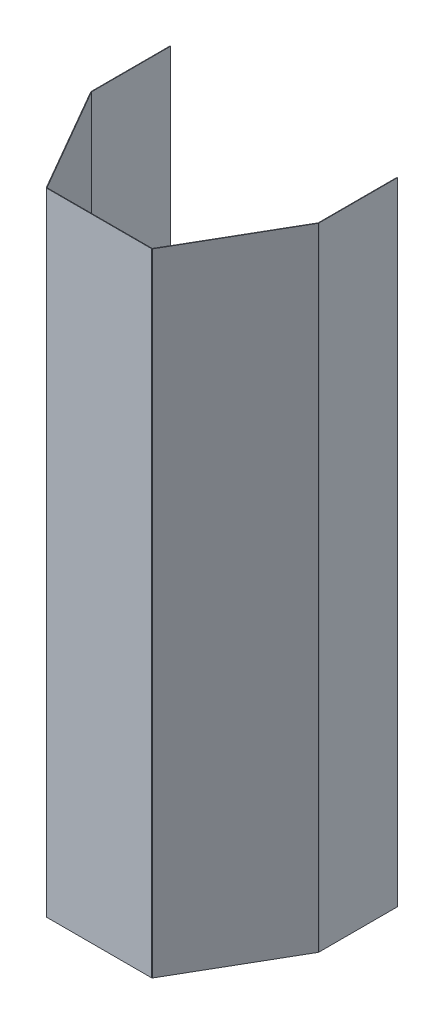
ISO-10303-21;
HEADER;
FILE_DESCRIPTION(('STEP AP214'),'2;1');
FILE_NAME('part.step','',(''),(''),'','','');
FILE_SCHEMA(('AUTOMOTIVE_DESIGN { 1 0 10303 214 1 1 1 1 }'));
ENDSEC;
DATA;
#1=APPLICATION_CONTEXT('core data for automotive mechanical design processes');
#2=APPLICATION_PROTOCOL_DEFINITION('international standard','automotive_design',2000,#1);
#3=PRODUCT_CONTEXT('',#1,'mechanical');
#4=PRODUCT('Part','Part','',(#3));
#5=PRODUCT_RELATED_PRODUCT_CATEGORY('part','',(#4));
#6=PRODUCT_DEFINITION_FORMATION('','',#4);
#7=PRODUCT_DEFINITION_CONTEXT('part definition',#1,'design');
#8=PRODUCT_DEFINITION('design','',#6,#7);
#9=PRODUCT_DEFINITION_SHAPE('','',#8);
#10=(LENGTH_UNIT() NAMED_UNIT(*) SI_UNIT(.MILLI.,.METRE.));
#11=(NAMED_UNIT(*) PLANE_ANGLE_UNIT() SI_UNIT($,.RADIAN.));
#12=(NAMED_UNIT(*) SI_UNIT($,.STERADIAN.) SOLID_ANGLE_UNIT());
#13=UNCERTAINTY_MEASURE_WITH_UNIT(LENGTH_MEASURE(1.E-05),#10,'distance_accuracy_value','');
#14=(GEOMETRIC_REPRESENTATION_CONTEXT(3) GLOBAL_UNCERTAINTY_ASSIGNED_CONTEXT((#13)) GLOBAL_UNIT_ASSIGNED_CONTEXT((#10,
#11,#12)) REPRESENTATION_CONTEXT('',''));
#15=CARTESIAN_POINT('',(0.,0.,0.));
#16=DIRECTION('',(0.,0.,1.));
#17=DIRECTION('',(1.,0.,0.));
#18=AXIS2_PLACEMENT_3D('',#15,#16,#17);
#19=CARTESIAN_POINT('',(-215.371368150354,1200.,-199.829071375145));
#20=DIRECTION('',(0.,1.,0.));
#21=DIRECTION('',(0.,0.,1.));
#22=AXIS2_PLACEMENT_3D('',#19,#20,#21);
#23=PLANE('',#22);
#24=DIRECTION('',(-0.866025403784471,0.,0.499999999999945));
#25=VECTOR('',#24,1.);
#26=CARTESIAN_POINT('',(-215.371368150354,1200.,-199.829071375145));
#27=LINE('',#26,#25);
#28=CARTESIAN_POINT('',(-215.371368150354,1200.,-199.829071375145));
#29=VERTEX_POINT('',#28);
#30=CARTESIAN_POINT('',(-216.237393554139,1200.,-199.329071375145));
#31=VERTEX_POINT('',#30);
#32=EDGE_CURVE('E11',#29,#31,#27,.T.);
#33=ORIENTED_EDGE('',*,*,#32,.F.);
#34=CARTESIAN_POINT('',(-214.733453837927,1200.,-200.197371375145));
#35=DIRECTION('',(0.,-1.,0.));
#36=DIRECTION('',(0.,0.,-1.));
#37=AXIS2_PLACEMENT_3D('',#34,#35,#36);
#38=CIRCLE('',#37,0.7366);
#39=CARTESIAN_POINT('',(-215.470053837926,1200.,-200.197371375145));
#40=VERTEX_POINT('',#39);
#41=EDGE_CURVE('E368',#40,#29,#38,.F.);
#42=ORIENTED_EDGE('',*,*,#41,.F.);
#43=DIRECTION('',(1.,0.,0.));
#44=VECTOR('',#43,1.);
#45=CARTESIAN_POINT('',(-216.470053837927,1200.,-200.197371375145));
#46=LINE('',#45,#44);
#47=CARTESIAN_POINT('',(-216.470053837927,1200.,-200.197371375145));
#48=VERTEX_POINT('',#47);
#49=EDGE_CURVE('E47',#48,#40,#46,.T.);
#50=ORIENTED_EDGE('',*,*,#49,.F.);
#51=CARTESIAN_POINT('',(-214.733453837927,1200.,-200.197371375145));
#52=DIRECTION('',(0.,1.,0.));
#53=DIRECTION('',(1.,0.,0.));
#54=AXIS2_PLACEMENT_3D('',#51,#52,#53);
#55=CIRCLE('',#54,1.7366);
#56=EDGE_CURVE('E381',#48,#31,#55,.T.);
#57=ORIENTED_EDGE('',*,*,#56,.T.);
#58=EDGE_LOOP('',(#33,#42,#50,#57));
#59=FACE_BOUND('',#58,.T.);
#60=ADVANCED_FACE('F39',(#59),#23,.T.);
#61=CARTESIAN_POINT('',(-216.470053837927,1200.,-200.197371375145));
#62=DIRECTION('',(0.,1.,0.));
#63=DIRECTION('',(0.,0.,1.));
#64=AXIS2_PLACEMENT_3D('',#61,#62,#63);
#65=PLANE('',#64);
#66=DIRECTION('',(0.500000000000004,0.,0.866025403784436));
#67=VECTOR('',#66,1.);
#68=CARTESIAN_POINT('',(-100.,1200.,0.));
#69=LINE('',#68,#67);
#70=CARTESIAN_POINT('',(-100.212638104143,1200.,-0.3683));
#71=VERTEX_POINT('',#70);
#72=EDGE_CURVE('E372',#29,#71,#69,.T.);
#73=ORIENTED_EDGE('',*,*,#72,.F.);
#74=ORIENTED_EDGE('',*,*,#32,.T.);
#75=DIRECTION('',(0.500000000000004,0.,0.866025403784436));
#76=VECTOR('',#75,1.);
#77=CARTESIAN_POINT('',(-100.866025403784,1200.,0.500000000000004));
#78=LINE('',#77,#76);
#79=CARTESIAN_POINT('',(-101.078663507927,1200.,0.131700000000003));
#80=VERTEX_POINT('',#79);
#81=EDGE_CURVE('E383',#31,#80,#78,.T.);
#82=ORIENTED_EDGE('',*,*,#81,.T.);
#83=DIRECTION('',(0.866025403784438,0.,-0.5));
#84=VECTOR('',#83,1.);
#85=CARTESIAN_POINT('',(-101.078663507927,1200.,0.131700000000003));
#86=LINE('',#85,#84);
#87=EDGE_CURVE('E342',#80,#71,#86,.T.);
#88=ORIENTED_EDGE('',*,*,#87,.T.);
#89=EDGE_LOOP('',(#73,#74,#82,#88));
#90=FACE_BOUND('',#89,.T.);
#91=ADVANCED_FACE('F452',(#90),#65,.T.);
#92=CARTESIAN_POINT('',(-215.470053837926,0.,-200.197371375145));
#93=DIRECTION('',(0.,-1.,0.));
#94=DIRECTION('',(0.,0.,-1.));
#95=AXIS2_PLACEMENT_3D('',#92,#93,#94);
#96=PLANE('',#95);
#97=DIRECTION('',(-1.,0.,0.));
#98=VECTOR('',#97,1.);
#99=CARTESIAN_POINT('',(-215.470053837926,0.,-200.197371375145));
#100=LINE('',#99,#98);
#101=CARTESIAN_POINT('',(-215.470053837926,0.,-200.197371375145));
#102=VERTEX_POINT('',#101);
#103=CARTESIAN_POINT('',(-216.470053837927,0.,-200.197371375145));
#104=VERTEX_POINT('',#103);
#105=EDGE_CURVE('E348',#102,#104,#100,.T.);
#106=ORIENTED_EDGE('',*,*,#105,.F.);
#107=CARTESIAN_POINT('',(-214.733453837927,0.,-200.197371375145));
#108=DIRECTION('',(0.,-1.,0.));
#109=DIRECTION('',(0.,0.,-1.));
#110=AXIS2_PLACEMENT_3D('',#107,#108,#109);
#111=CIRCLE('',#110,0.7366);
#112=CARTESIAN_POINT('',(-215.371368150354,0.,-199.829071375145));
#113=VERTEX_POINT('',#112);
#114=EDGE_CURVE('E252',#102,#113,#111,.F.);
#115=ORIENTED_EDGE('',*,*,#114,.T.);
#116=DIRECTION('',(0.866025403784471,0.,-0.499999999999945));
#117=VECTOR('',#116,1.);
#118=CARTESIAN_POINT('',(-216.237393554139,0.,-199.329071375145));
#119=LINE('',#118,#117);
#120=CARTESIAN_POINT('',(-216.237393554139,0.,-199.329071375145));
#121=VERTEX_POINT('',#120);
#122=EDGE_CURVE('E346',#121,#113,#119,.T.);
#123=ORIENTED_EDGE('',*,*,#122,.F.);
#124=CARTESIAN_POINT('',(-214.733453837927,0.,-200.197371375145));
#125=DIRECTION('',(0.,1.,0.));
#126=DIRECTION('',(1.,0.,0.));
#127=AXIS2_PLACEMENT_3D('',#124,#125,#126);
#128=CIRCLE('',#127,1.7366);
#129=EDGE_CURVE('E264',#104,#121,#128,.T.);
#130=ORIENTED_EDGE('',*,*,#129,.F.);
#131=EDGE_LOOP('',(#106,#115,#123,#130));
#132=FACE_BOUND('',#131,.T.);
#133=ADVANCED_FACE('F494',(#132),#96,.T.);
#134=CARTESIAN_POINT('',(-216.237393554139,0.,-199.329071375145));
#135=DIRECTION('',(0.,-1.,0.));
#136=DIRECTION('',(0.,0.,-1.));
#137=AXIS2_PLACEMENT_3D('',#134,#135,#136);
#138=PLANE('',#137);
#139=DIRECTION('',(0.,0.,1.));
#140=VECTOR('',#139,1.);
#141=CARTESIAN_POINT('',(-215.470053837926,0.,-200.));
#142=LINE('',#141,#140);
#143=CARTESIAN_POINT('',(-215.470053837926,0.,-350.));
#144=VERTEX_POINT('',#143);
#145=EDGE_CURVE('E255',#144,#102,#142,.T.);
#146=ORIENTED_EDGE('',*,*,#145,.T.);
#147=ORIENTED_EDGE('',*,*,#105,.T.);
#148=DIRECTION('',(0.,0.,1.));
#149=VECTOR('',#148,1.);
#150=CARTESIAN_POINT('',(-216.470053837926,0.,-200.));
#151=LINE('',#150,#149);
#152=CARTESIAN_POINT('',(-216.470053837926,0.,-350.));
#153=VERTEX_POINT('',#152);
#154=EDGE_CURVE('E261',#153,#104,#151,.T.);
#155=ORIENTED_EDGE('',*,*,#154,.F.);
#156=DIRECTION('',(1.,0.,0.));
#157=VECTOR('',#156,1.);
#158=CARTESIAN_POINT('',(-216.470053837926,0.,-350.));
#159=LINE('',#158,#157);
#160=EDGE_CURVE('E258',#153,#144,#159,.T.);
#161=ORIENTED_EDGE('',*,*,#160,.T.);
#162=EDGE_LOOP('',(#146,#147,#155,#161));
#163=FACE_BOUND('',#162,.T.);
#164=ADVANCED_FACE('F498',(#163),#138,.T.);
#165=CARTESIAN_POINT('',(-99.5747237917149,1200.,0.));
#166=DIRECTION('',(0.,1.,0.));
#167=DIRECTION('',(0.,0.,1.));
#168=AXIS2_PLACEMENT_3D('',#165,#166,#167);
#169=PLANE('',#168);
#170=DIRECTION('',(0.,0.,1.));
#171=VECTOR('',#170,1.);
#172=CARTESIAN_POINT('',(-99.5747237917149,1200.,0.));
#173=LINE('',#172,#171);
#174=CARTESIAN_POINT('',(-99.5747237917149,1200.,0.));
#175=VERTEX_POINT('',#174);
#176=CARTESIAN_POINT('',(-99.5747237917149,1200.,1.));
#177=VERTEX_POINT('',#176);
#178=EDGE_CURVE('E344',#175,#177,#173,.T.);
#179=ORIENTED_EDGE('',*,*,#178,.F.);
#180=CARTESIAN_POINT('',(-99.5747237917149,1200.,-0.736600000000001));
#181=DIRECTION('',(0.,-1.,0.));
#182=DIRECTION('',(0.,0.,-1.));
#183=AXIS2_PLACEMENT_3D('',#180,#181,#182);
#184=CIRCLE('',#183,0.7366);
#185=EDGE_CURVE('E442',#71,#175,#184,.F.);
#186=ORIENTED_EDGE('',*,*,#185,.F.);
#187=ORIENTED_EDGE('',*,*,#87,.F.);
#188=CARTESIAN_POINT('',(-99.5747237917149,1200.,-0.736600000000001));
#189=DIRECTION('',(0.,1.,0.));
#190=DIRECTION('',(1.,0.,0.));
#191=AXIS2_PLACEMENT_3D('',#188,#189,#190);
#192=CIRCLE('',#191,1.7366);
#193=EDGE_CURVE('E386',#80,#177,#192,.T.);
#194=ORIENTED_EDGE('',*,*,#193,.T.);
#195=EDGE_LOOP('',(#179,#186,#187,#194));
#196=FACE_BOUND('',#195,.T.);
#197=ADVANCED_FACE('F459',(#196),#169,.T.);
#198=CARTESIAN_POINT('',(-101.078663507927,1200.,0.131700000000003));
#199=DIRECTION('',(0.,1.,0.));
#200=DIRECTION('',(0.,0.,1.));
#201=AXIS2_PLACEMENT_3D('',#198,#199,#200);
#202=PLANE('',#201);
#203=DIRECTION('',(1.,0.,0.));
#204=VECTOR('',#203,1.);
#205=CARTESIAN_POINT('',(-100.,1200.,0.));
#206=LINE('',#205,#204);
#207=CARTESIAN_POINT('',(99.5747237917149,1200.,0.));
#208=VERTEX_POINT('',#207);
#209=EDGE_CURVE('E439',#175,#208,#206,.T.);
#210=ORIENTED_EDGE('',*,*,#209,.F.);
#211=ORIENTED_EDGE('',*,*,#178,.T.);
#212=DIRECTION('',(1.,0.,0.));
#213=VECTOR('',#212,1.);
#214=CARTESIAN_POINT('',(-100.,1200.,1.));
#215=LINE('',#214,#213);
#216=CARTESIAN_POINT('',(99.5747237917149,1200.,0.999999999999969));
#217=VERTEX_POINT('',#216);
#218=EDGE_CURVE('E206',#177,#217,#215,.T.);
#219=ORIENTED_EDGE('',*,*,#218,.T.);
#220=DIRECTION('',(0.,0.,-1.));
#221=VECTOR('',#220,1.);
#222=CARTESIAN_POINT('',(99.5747237917149,1200.,0.999999999999969));
#223=LINE('',#222,#221);
#224=EDGE_CURVE('E197',#217,#208,#223,.T.);
#225=ORIENTED_EDGE('',*,*,#224,.T.);
#226=EDGE_LOOP('',(#210,#211,#219,#225));
#227=FACE_BOUND('',#226,.T.);
#228=ADVANCED_FACE('F392',(#227),#202,.T.);
#229=CARTESIAN_POINT('',(-100.212638104143,0.,-0.3683));
#230=DIRECTION('',(0.,-1.,0.));
#231=DIRECTION('',(0.,0.,-1.));
#232=AXIS2_PLACEMENT_3D('',#229,#230,#231);
#233=PLANE('',#232);
#234=DIRECTION('',(-0.866025403784438,0.,0.5));
#235=VECTOR('',#234,1.);
#236=CARTESIAN_POINT('',(-100.212638104143,0.,-0.3683));
#237=LINE('',#236,#235);
#238=CARTESIAN_POINT('',(-100.212638104143,0.,-0.3683));
#239=VERTEX_POINT('',#238);
#240=CARTESIAN_POINT('',(-101.078663507927,0.,0.131700000000003));
#241=VERTEX_POINT('',#240);
#242=EDGE_CURVE('E340',#239,#241,#237,.T.);
#243=ORIENTED_EDGE('',*,*,#242,.F.);
#244=CARTESIAN_POINT('',(-99.5747237917149,0.,-0.736600000000001));
#245=DIRECTION('',(0.,-1.,0.));
#246=DIRECTION('',(0.,0.,-1.));
#247=AXIS2_PLACEMENT_3D('',#244,#245,#246);
#248=CIRCLE('',#247,0.7366);
#249=CARTESIAN_POINT('',(-99.5747237917149,0.,0.));
#250=VERTEX_POINT('',#249);
#251=EDGE_CURVE('E246',#239,#250,#248,.F.);
#252=ORIENTED_EDGE('',*,*,#251,.T.);
#253=DIRECTION('',(0.,0.,-1.));
#254=VECTOR('',#253,1.);
#255=CARTESIAN_POINT('',(-99.5747237917149,0.,1.));
#256=LINE('',#255,#254);
#257=CARTESIAN_POINT('',(-99.5747237917149,0.,1.));
#258=VERTEX_POINT('',#257);
#259=EDGE_CURVE('E196',#258,#250,#256,.T.);
#260=ORIENTED_EDGE('',*,*,#259,.F.);
#261=CARTESIAN_POINT('',(-99.5747237917149,0.,-0.736600000000001));
#262=DIRECTION('',(0.,1.,0.));
#263=DIRECTION('',(1.,0.,0.));
#264=AXIS2_PLACEMENT_3D('',#261,#262,#263);
#265=CIRCLE('',#264,1.7366);
#266=EDGE_CURVE('E270',#241,#258,#265,.T.);
#267=ORIENTED_EDGE('',*,*,#266,.F.);
#268=EDGE_LOOP('',(#243,#252,#260,#267));
#269=FACE_BOUND('',#268,.T.);
#270=ADVANCED_FACE('F468',(#269),#233,.T.);
#271=CARTESIAN_POINT('',(-99.5747237917149,0.,1.));
#272=DIRECTION('',(0.,-1.,0.));
#273=DIRECTION('',(0.,0.,-1.));
#274=AXIS2_PLACEMENT_3D('',#271,#272,#273);
#275=PLANE('',#274);
#276=DIRECTION('',(0.500000000000004,0.,0.866025403784436));
#277=VECTOR('',#276,1.);
#278=CARTESIAN_POINT('',(-100.,0.,0.));
#279=LINE('',#278,#277);
#280=EDGE_CURVE('E249',#113,#239,#279,.T.);
#281=ORIENTED_EDGE('',*,*,#280,.T.);
#282=ORIENTED_EDGE('',*,*,#242,.T.);
#283=DIRECTION('',(0.500000000000004,0.,0.866025403784436));
#284=VECTOR('',#283,1.);
#285=CARTESIAN_POINT('',(-100.866025403784,0.,0.500000000000004));
#286=LINE('',#285,#284);
#287=EDGE_CURVE('E267',#121,#241,#286,.T.);
#288=ORIENTED_EDGE('',*,*,#287,.F.);
#289=ORIENTED_EDGE('',*,*,#122,.T.);
#290=EDGE_LOOP('',(#281,#282,#288,#289));
#291=FACE_BOUND('',#290,.T.);
#292=ADVANCED_FACE('F472',(#291),#275,.T.);
#293=CARTESIAN_POINT('',(100.212638104143,1200.,-0.368300000000029));
#294=DIRECTION('',(0.,1.,0.));
#295=DIRECTION('',(0.,0.,1.));
#296=AXIS2_PLACEMENT_3D('',#293,#294,#295);
#297=PLANE('',#296);
#298=DIRECTION('',(0.86602540378444,0.,0.499999999999998));
#299=VECTOR('',#298,1.);
#300=CARTESIAN_POINT('',(100.212638104143,1200.,-0.368300000000029));
#301=LINE('',#300,#299);
#302=CARTESIAN_POINT('',(100.212638104143,1200.,-0.368300000000029));
#303=VERTEX_POINT('',#302);
#304=CARTESIAN_POINT('',(101.078663507927,1200.,0.131699999999971));
#305=VERTEX_POINT('',#304);
#306=EDGE_CURVE('E184',#303,#305,#301,.T.);
#307=ORIENTED_EDGE('',*,*,#306,.F.);
#308=CARTESIAN_POINT('',(99.5747237917149,1200.,-0.736600000000031));
#309=DIRECTION('',(0.,-1.,0.));
#310=DIRECTION('',(0.,0.,-1.));
#311=AXIS2_PLACEMENT_3D('',#308,#309,#310);
#312=CIRCLE('',#311,0.7366);
#313=EDGE_CURVE('E404',#208,#303,#312,.F.);
#314=ORIENTED_EDGE('',*,*,#313,.F.);
#315=ORIENTED_EDGE('',*,*,#224,.F.);
#316=CARTESIAN_POINT('',(99.5747237917149,1200.,-0.736600000000031));
#317=DIRECTION('',(0.,1.,0.));
#318=DIRECTION('',(1.,0.,0.));
#319=AXIS2_PLACEMENT_3D('',#316,#317,#318);
#320=CIRCLE('',#319,1.7366);
#321=EDGE_CURVE('E200',#217,#305,#320,.T.);
#322=ORIENTED_EDGE('',*,*,#321,.T.);
#323=EDGE_LOOP('',(#307,#314,#315,#322));
#324=FACE_BOUND('',#323,.T.);
#325=ADVANCED_FACE('F202',(#324),#297,.T.);
#326=CARTESIAN_POINT('',(99.5747237917149,1200.,0.999999999999969));
#327=DIRECTION('',(0.,1.,0.));
#328=DIRECTION('',(0.,0.,1.));
#329=AXIS2_PLACEMENT_3D('',#326,#327,#328);
#330=PLANE('',#329);
#331=DIRECTION('',(0.499999999999998,0.,-0.86602540378444));
#332=VECTOR('',#331,1.);
#333=CARTESIAN_POINT('',(100.,1200.,0.));
#334=LINE('',#333,#332);
#335=CARTESIAN_POINT('',(215.371368150352,1200.,-199.829071375145));
#336=VERTEX_POINT('',#335);
#337=EDGE_CURVE('E191',#303,#336,#334,.T.);
#338=ORIENTED_EDGE('',*,*,#337,.F.);
#339=ORIENTED_EDGE('',*,*,#306,.T.);
#340=DIRECTION('',(0.499999999999998,0.,-0.86602540378444));
#341=VECTOR('',#340,1.);
#342=CARTESIAN_POINT('',(100.866025403784,1200.,0.499999999999961));
#343=LINE('',#342,#341);
#344=CARTESIAN_POINT('',(216.237393554136,1200.,-199.329071375145));
#345=VERTEX_POINT('',#344);
#346=EDGE_CURVE('E188',#305,#345,#343,.T.);
#347=ORIENTED_EDGE('',*,*,#346,.T.);
#348=DIRECTION('',(-0.866025403784404,0.,-0.500000000000061));
#349=VECTOR('',#348,1.);
#350=CARTESIAN_POINT('',(216.237393554136,1200.,-199.329071375145));
#351=LINE('',#350,#349);
#352=EDGE_CURVE('E331',#345,#336,#351,.T.);
#353=ORIENTED_EDGE('',*,*,#352,.T.);
#354=EDGE_LOOP('',(#338,#339,#347,#353));
#355=FACE_BOUND('',#354,.T.);
#356=ADVANCED_FACE('F186',(#355),#330,.T.);
#357=CARTESIAN_POINT('',(99.5747237917149,0.,0.));
#358=DIRECTION('',(0.,-1.,0.));
#359=DIRECTION('',(0.,0.,-1.));
#360=AXIS2_PLACEMENT_3D('',#357,#358,#359);
#361=PLANE('',#360);
#362=DIRECTION('',(0.,0.,1.));
#363=VECTOR('',#362,1.);
#364=CARTESIAN_POINT('',(99.5747237917149,0.,0.));
#365=LINE('',#364,#363);
#366=CARTESIAN_POINT('',(99.5747237917149,0.,0.));
#367=VERTEX_POINT('',#366);
#368=CARTESIAN_POINT('',(99.5747237917149,0.,0.999999999999969));
#369=VERTEX_POINT('',#368);
#370=EDGE_CURVE('E336',#367,#369,#365,.T.);
#371=ORIENTED_EDGE('',*,*,#370,.F.);
#372=CARTESIAN_POINT('',(99.5747237917149,0.,-0.736600000000031));
#373=DIRECTION('',(0.,-1.,0.));
#374=DIRECTION('',(0.,0.,-1.));
#375=AXIS2_PLACEMENT_3D('',#372,#373,#374);
#376=CIRCLE('',#375,0.7366);
#377=CARTESIAN_POINT('',(100.212638104143,0.,-0.368300000000029));
#378=VERTEX_POINT('',#377);
#379=EDGE_CURVE('E240',#367,#378,#376,.F.);
#380=ORIENTED_EDGE('',*,*,#379,.T.);
#381=DIRECTION('',(-0.86602540378444,0.,-0.499999999999998));
#382=VECTOR('',#381,1.);
#383=CARTESIAN_POINT('',(101.078663507927,0.,0.131699999999971));
#384=LINE('',#383,#382);
#385=CARTESIAN_POINT('',(101.078663507927,0.,0.131699999999971));
#386=VERTEX_POINT('',#385);
#387=EDGE_CURVE('E334',#386,#378,#384,.T.);
#388=ORIENTED_EDGE('',*,*,#387,.F.);
#389=CARTESIAN_POINT('',(99.5747237917149,0.,-0.736600000000031));
#390=DIRECTION('',(0.,1.,0.));
#391=DIRECTION('',(1.,0.,0.));
#392=AXIS2_PLACEMENT_3D('',#389,#390,#391);
#393=CIRCLE('',#392,1.7366);
#394=EDGE_CURVE('E213',#369,#386,#393,.T.);
#395=ORIENTED_EDGE('',*,*,#394,.F.);
#396=EDGE_LOOP('',(#371,#380,#388,#395));
#397=FACE_BOUND('',#396,.T.);
#398=ADVANCED_FACE('F398',(#397),#361,.T.);
#399=CARTESIAN_POINT('',(101.078663507927,0.,0.131699999999971));
#400=DIRECTION('',(0.,-1.,0.));
#401=DIRECTION('',(0.,0.,-1.));
#402=AXIS2_PLACEMENT_3D('',#399,#400,#401);
#403=PLANE('',#402);
#404=DIRECTION('',(1.,0.,0.));
#405=VECTOR('',#404,1.);
#406=CARTESIAN_POINT('',(-100.,0.,0.));
#407=LINE('',#406,#405);
#408=EDGE_CURVE('E243',#250,#367,#407,.T.);
#409=ORIENTED_EDGE('',*,*,#408,.T.);
#410=ORIENTED_EDGE('',*,*,#370,.T.);
#411=DIRECTION('',(1.,0.,0.));
#412=VECTOR('',#411,1.);
#413=CARTESIAN_POINT('',(-100.,0.,1.));
#414=LINE('',#413,#412);
#415=EDGE_CURVE('E273',#258,#369,#414,.T.);
#416=ORIENTED_EDGE('',*,*,#415,.F.);
#417=ORIENTED_EDGE('',*,*,#259,.T.);
#418=EDGE_LOOP('',(#409,#410,#416,#417));
#419=FACE_BOUND('',#418,.T.);
#420=ADVANCED_FACE('F478',(#419),#403,.T.);
#421=CARTESIAN_POINT('',(215.470053837924,1200.,-200.197371375145));
#422=DIRECTION('',(0.,1.,0.));
#423=DIRECTION('',(0.,0.,1.));
#424=AXIS2_PLACEMENT_3D('',#421,#422,#423);
#425=PLANE('',#424);
#426=DIRECTION('',(1.,0.,0.));
#427=VECTOR('',#426,1.);
#428=CARTESIAN_POINT('',(215.470053837924,1200.,-200.197371375145));
#429=LINE('',#428,#427);
#430=CARTESIAN_POINT('',(215.470053837924,1200.,-200.197371375145));
#431=VERTEX_POINT('',#430);
#432=CARTESIAN_POINT('',(216.470053837924,1200.,-200.197371375145));
#433=VERTEX_POINT('',#432);
#434=EDGE_CURVE('E55',#431,#433,#429,.T.);
#435=ORIENTED_EDGE('',*,*,#434,.F.);
#436=CARTESIAN_POINT('',(214.733453837924,1200.,-200.197371375145));
#437=DIRECTION('',(0.,-1.,0.));
#438=DIRECTION('',(0.,0.,-1.));
#439=AXIS2_PLACEMENT_3D('',#436,#437,#438);
#440=CIRCLE('',#439,0.7366);
#441=EDGE_CURVE('E432',#336,#431,#440,.F.);
#442=ORIENTED_EDGE('',*,*,#441,.F.);
#443=ORIENTED_EDGE('',*,*,#352,.F.);
#444=CARTESIAN_POINT('',(214.733453837924,1200.,-200.197371375145));
#445=DIRECTION('',(0.,1.,0.));
#446=DIRECTION('',(1.,0.,0.));
#447=AXIS2_PLACEMENT_3D('',#444,#445,#446);
#448=CIRCLE('',#447,1.7366);
#449=EDGE_CURVE('E221',#345,#433,#448,.T.);
#450=ORIENTED_EDGE('',*,*,#449,.T.);
#451=EDGE_LOOP('',(#435,#442,#443,#450));
#452=FACE_BOUND('',#451,.T.);
#453=ADVANCED_FACE('F480',(#452),#425,.T.);
#454=CARTESIAN_POINT('',(216.237393554136,1200.,-199.329071375145));
#455=DIRECTION('',(0.,1.,0.));
#456=DIRECTION('',(0.,0.,1.));
#457=AXIS2_PLACEMENT_3D('',#454,#455,#456);
#458=PLANE('',#457);
#459=DIRECTION('',(0.,0.,-1.));
#460=VECTOR('',#459,1.);
#461=CARTESIAN_POINT('',(215.470053837924,1200.,-200.));
#462=LINE('',#461,#460);
#463=CARTESIAN_POINT('',(215.470053837924,1200.,-350.));
#464=VERTEX_POINT('',#463);
#465=EDGE_CURVE('E430',#431,#464,#462,.T.);
#466=ORIENTED_EDGE('',*,*,#465,.F.);
#467=ORIENTED_EDGE('',*,*,#434,.T.);
#468=DIRECTION('',(0.,0.,-1.));
#469=VECTOR('',#468,1.);
#470=CARTESIAN_POINT('',(216.470053837924,1200.,-200.));
#471=LINE('',#470,#469);
#472=CARTESIAN_POINT('',(216.470053837924,1200.,-350.));
#473=VERTEX_POINT('',#472);
#474=EDGE_CURVE('E133',#433,#473,#471,.T.);
#475=ORIENTED_EDGE('',*,*,#474,.T.);
#476=DIRECTION('',(1.,0.,0.));
#477=VECTOR('',#476,1.);
#478=CARTESIAN_POINT('',(215.470053837924,1200.,-350.));
#479=LINE('',#478,#477);
#480=EDGE_CURVE('E428',#464,#473,#479,.T.);
#481=ORIENTED_EDGE('',*,*,#480,.F.);
#482=EDGE_LOOP('',(#466,#467,#475,#481));
#483=FACE_BOUND('',#482,.T.);
#484=ADVANCED_FACE('F486',(#483),#458,.T.);
#485=CARTESIAN_POINT('',(215.371368150352,0.,-199.829071375145));
#486=DIRECTION('',(0.,-1.,0.));
#487=DIRECTION('',(0.,0.,-1.));
#488=AXIS2_PLACEMENT_3D('',#485,#486,#487);
#489=PLANE('',#488);
#490=DIRECTION('',(0.866025403784404,0.,0.500000000000061));
#491=VECTOR('',#490,1.);
#492=CARTESIAN_POINT('',(215.371368150352,0.,-199.829071375145));
#493=LINE('',#492,#491);
#494=CARTESIAN_POINT('',(215.371368150352,0.,-199.829071375145));
#495=VERTEX_POINT('',#494);
#496=CARTESIAN_POINT('',(216.237393554136,0.,-199.329071375145));
#497=VERTEX_POINT('',#496);
#498=EDGE_CURVE('E120',#495,#497,#493,.T.);
#499=ORIENTED_EDGE('',*,*,#498,.F.);
#500=CARTESIAN_POINT('',(214.733453837924,0.,-200.197371375145));
#501=DIRECTION('',(0.,-1.,0.));
#502=DIRECTION('',(0.,0.,-1.));
#503=AXIS2_PLACEMENT_3D('',#500,#501,#502);
#504=CIRCLE('',#503,0.7366);
#505=CARTESIAN_POINT('',(215.470053837924,0.,-200.197371375145));
#506=VERTEX_POINT('',#505);
#507=EDGE_CURVE('E236',#495,#506,#504,.F.);
#508=ORIENTED_EDGE('',*,*,#507,.T.);
#509=DIRECTION('',(-1.,0.,0.));
#510=VECTOR('',#509,1.);
#511=CARTESIAN_POINT('',(216.470053837924,0.,-200.197371375145));
#512=LINE('',#511,#510);
#513=CARTESIAN_POINT('',(216.470053837924,0.,-200.197371375145));
#514=VERTEX_POINT('',#513);
#515=EDGE_CURVE('E127',#514,#506,#512,.T.);
#516=ORIENTED_EDGE('',*,*,#515,.F.);
#517=CARTESIAN_POINT('',(214.733453837924,0.,-200.197371375145));
#518=DIRECTION('',(0.,1.,0.));
#519=DIRECTION('',(1.,0.,0.));
#520=AXIS2_PLACEMENT_3D('',#517,#518,#519);
#521=CIRCLE('',#520,1.7366);
#522=EDGE_CURVE('E279',#497,#514,#521,.T.);
#523=ORIENTED_EDGE('',*,*,#522,.F.);
#524=EDGE_LOOP('',(#499,#508,#516,#523));
#525=FACE_BOUND('',#524,.T.);
#526=ADVANCED_FACE('F415',(#525),#489,.T.);
#527=CARTESIAN_POINT('',(216.470053837924,0.,-200.197371375145));
#528=DIRECTION('',(0.,-1.,0.));
#529=DIRECTION('',(0.,0.,-1.));
#530=AXIS2_PLACEMENT_3D('',#527,#528,#529);
#531=PLANE('',#530);
#532=DIRECTION('',(0.499999999999998,0.,-0.86602540378444));
#533=VECTOR('',#532,1.);
#534=CARTESIAN_POINT('',(100.,0.,0.));
#535=LINE('',#534,#533);
#536=EDGE_CURVE('E238',#378,#495,#535,.T.);
#537=ORIENTED_EDGE('',*,*,#536,.T.);
#538=ORIENTED_EDGE('',*,*,#498,.T.);
#539=DIRECTION('',(0.499999999999998,0.,-0.86602540378444));
#540=VECTOR('',#539,1.);
#541=CARTESIAN_POINT('',(100.866025403784,0.,0.499999999999961));
#542=LINE('',#541,#540);
#543=EDGE_CURVE('E277',#386,#497,#542,.T.);
#544=ORIENTED_EDGE('',*,*,#543,.F.);
#545=ORIENTED_EDGE('',*,*,#387,.T.);
#546=EDGE_LOOP('',(#537,#538,#544,#545));
#547=FACE_BOUND('',#546,.T.);
#548=ADVANCED_FACE('F400',(#547),#531,.T.);
#549=CARTESIAN_POINT('',(216.470053837924,1200.,-200.));
#550=DIRECTION('',(-1.,0.,0.));
#551=DIRECTION('',(0.,0.,1.));
#552=AXIS2_PLACEMENT_3D('',#549,#550,#551);
#553=PLANE('',#552);
#554=DIRECTION('',(0.,0.,-1.));
#555=VECTOR('',#554,1.);
#556=CARTESIAN_POINT('',(216.470053837924,0.,-200.));
#557=LINE('',#556,#555);
#558=CARTESIAN_POINT('',(216.470053837924,0.,-350.));
#559=VERTEX_POINT('',#558);
#560=EDGE_CURVE('E227',#514,#559,#557,.T.);
#561=ORIENTED_EDGE('',*,*,#560,.T.);
#562=DIRECTION('',(0.,-1.,0.));
#563=VECTOR('',#562,1.);
#564=CARTESIAN_POINT('',(216.470053837924,1200.,-350.));
#565=LINE('',#564,#563);
#566=EDGE_CURVE('E327',#473,#559,#565,.T.);
#567=ORIENTED_EDGE('',*,*,#566,.F.);
#568=ORIENTED_EDGE('',*,*,#474,.F.);
#569=DIRECTION('',(0.,-1.,0.));
#570=VECTOR('',#569,1.);
#571=CARTESIAN_POINT('',(216.470053837924,1200.,-200.197371375145));
#572=LINE('',#571,#570);
#573=EDGE_CURVE('E223',#433,#514,#572,.T.);
#574=ORIENTED_EDGE('',*,*,#573,.T.);
#575=EDGE_LOOP('',(#561,#567,#568,#574));
#576=FACE_BOUND('',#575,.T.);
#577=ADVANCED_FACE('F421',(#576),#553,.F.);
#578=CARTESIAN_POINT('',(215.470053837924,1200.,-350.));
#579=DIRECTION('',(0.,0.,-1.));
#580=DIRECTION('',(-1.,0.,0.));
#581=AXIS2_PLACEMENT_3D('',#578,#579,#580);
#582=PLANE('',#581);
#583=DIRECTION('',(1.,0.,0.));
#584=VECTOR('',#583,1.);
#585=CARTESIAN_POINT('',(215.470053837924,0.,-350.));
#586=LINE('',#585,#584);
#587=CARTESIAN_POINT('',(215.470053837924,0.,-350.));
#588=VERTEX_POINT('',#587);
#589=EDGE_CURVE('E230',#588,#559,#586,.T.);
#590=ORIENTED_EDGE('',*,*,#589,.F.);
#591=DIRECTION('',(0.,-1.,0.));
#592=VECTOR('',#591,1.);
#593=CARTESIAN_POINT('',(215.470053837924,1200.,-350.));
#594=LINE('',#593,#592);
#595=EDGE_CURVE('E325',#464,#588,#594,.T.);
#596=ORIENTED_EDGE('',*,*,#595,.F.);
#597=ORIENTED_EDGE('',*,*,#480,.T.);
#598=ORIENTED_EDGE('',*,*,#566,.T.);
#599=EDGE_LOOP('',(#590,#596,#597,#598));
#600=FACE_BOUND('',#599,.T.);
#601=ADVANCED_FACE('F426',(#600),#582,.T.);
#602=CARTESIAN_POINT('',(215.470053837924,1200.,-200.));
#603=DIRECTION('',(-1.,0.,0.));
#604=DIRECTION('',(0.,0.,1.));
#605=AXIS2_PLACEMENT_3D('',#602,#603,#604);
#606=PLANE('',#605);
#607=DIRECTION('',(0.,0.,-1.));
#608=VECTOR('',#607,1.);
#609=CARTESIAN_POINT('',(215.470053837924,0.,-200.));
#610=LINE('',#609,#608);
#611=EDGE_CURVE('E233',#506,#588,#610,.T.);
#612=ORIENTED_EDGE('',*,*,#611,.F.);
#613=DIRECTION('',(0.,-1.,0.));
#614=VECTOR('',#613,1.);
#615=CARTESIAN_POINT('',(215.470053837924,1200.,-200.197371375145));
#616=LINE('',#615,#614);
#617=EDGE_CURVE('E322',#431,#506,#616,.T.);
#618=ORIENTED_EDGE('',*,*,#617,.F.);
#619=ORIENTED_EDGE('',*,*,#465,.T.);
#620=ORIENTED_EDGE('',*,*,#595,.T.);
#621=EDGE_LOOP('',(#612,#618,#619,#620));
#622=FACE_BOUND('',#621,.T.);
#623=ADVANCED_FACE('F582',(#622),#606,.T.);
#624=CARTESIAN_POINT('',(214.733453837924,1200.,-200.197371375145));
#625=DIRECTION('',(0.,-1.,0.));
#626=DIRECTION('',(0.,0.,-1.));
#627=AXIS2_PLACEMENT_3D('',#624,#625,#626);
#628=CYLINDRICAL_SURFACE('',#627,0.7366);
#629=ORIENTED_EDGE('',*,*,#507,.F.);
#630=DIRECTION('',(0.,-1.,0.));
#631=VECTOR('',#630,1.);
#632=CARTESIAN_POINT('',(215.371368150352,1200.,-199.829071375145));
#633=LINE('',#632,#631);
#634=EDGE_CURVE('E319',#336,#495,#633,.T.);
#635=ORIENTED_EDGE('',*,*,#634,.F.);
#636=ORIENTED_EDGE('',*,*,#441,.T.);
#637=ORIENTED_EDGE('',*,*,#617,.T.);
#638=EDGE_LOOP('',(#629,#635,#636,#637));
#639=FACE_BOUND('',#638,.T.);
#640=ADVANCED_FACE('F412',(#639),#628,.F.);
#641=CARTESIAN_POINT('',(100.,1200.,0.));
#642=DIRECTION('',(-0.86602540378444,0.,-0.499999999999998));
#643=DIRECTION('',(-0.499999999999998,0.,0.86602540378444));
#644=AXIS2_PLACEMENT_3D('',#641,#642,#643);
#645=PLANE('',#644);
#646=ORIENTED_EDGE('',*,*,#536,.F.);
#647=DIRECTION('',(0.,-1.,0.));
#648=VECTOR('',#647,1.);
#649=CARTESIAN_POINT('',(100.212638104143,1200.,-0.368300000000029));
#650=LINE('',#649,#648);
#651=EDGE_CURVE('E316',#303,#378,#650,.T.);
#652=ORIENTED_EDGE('',*,*,#651,.F.);
#653=ORIENTED_EDGE('',*,*,#337,.T.);
#654=ORIENTED_EDGE('',*,*,#634,.T.);
#655=EDGE_LOOP('',(#646,#652,#653,#654));
#656=FACE_BOUND('',#655,.T.);
#657=ADVANCED_FACE('F406',(#656),#645,.T.);
#658=CARTESIAN_POINT('',(99.5747237917149,1200.,-0.736600000000031));
#659=DIRECTION('',(0.,-1.,0.));
#660=DIRECTION('',(0.,0.,-1.));
#661=AXIS2_PLACEMENT_3D('',#658,#659,#660);
#662=CYLINDRICAL_SURFACE('',#661,0.7366);
#663=ORIENTED_EDGE('',*,*,#379,.F.);
#664=DIRECTION('',(0.,-1.,0.));
#665=VECTOR('',#664,1.);
#666=CARTESIAN_POINT('',(99.5747237917149,1200.,0.));
#667=LINE('',#666,#665);
#668=EDGE_CURVE('E313',#208,#367,#667,.T.);
#669=ORIENTED_EDGE('',*,*,#668,.F.);
#670=ORIENTED_EDGE('',*,*,#313,.T.);
#671=ORIENTED_EDGE('',*,*,#651,.T.);
#672=EDGE_LOOP('',(#663,#669,#670,#671));
#673=FACE_BOUND('',#672,.T.);
#674=ADVANCED_FACE('F403',(#673),#662,.F.);
#675=CARTESIAN_POINT('',(-100.,1200.,0.));
#676=DIRECTION('',(0.,0.,-1.));
#677=DIRECTION('',(-1.,0.,0.));
#678=AXIS2_PLACEMENT_3D('',#675,#676,#677);
#679=PLANE('',#678);
#680=ORIENTED_EDGE('',*,*,#408,.F.);
#681=DIRECTION('',(0.,-1.,0.));
#682=VECTOR('',#681,1.);
#683=CARTESIAN_POINT('',(-99.5747237917149,1200.,0.));
#684=LINE('',#683,#682);
#685=EDGE_CURVE('E310',#175,#250,#684,.T.);
#686=ORIENTED_EDGE('',*,*,#685,.F.);
#687=ORIENTED_EDGE('',*,*,#209,.T.);
#688=ORIENTED_EDGE('',*,*,#668,.T.);
#689=EDGE_LOOP('',(#680,#686,#687,#688));
#690=FACE_BOUND('',#689,.T.);
#691=ADVANCED_FACE('F465',(#690),#679,.T.);
#692=CARTESIAN_POINT('',(-99.5747237917149,1200.,-0.736600000000001));
#693=DIRECTION('',(0.,-1.,0.));
#694=DIRECTION('',(0.,0.,-1.));
#695=AXIS2_PLACEMENT_3D('',#692,#693,#694);
#696=CYLINDRICAL_SURFACE('',#695,0.7366);
#697=ORIENTED_EDGE('',*,*,#251,.F.);
#698=DIRECTION('',(0.,-1.,0.));
#699=VECTOR('',#698,1.);
#700=CARTESIAN_POINT('',(-100.212638104143,1200.,-0.3683));
#701=LINE('',#700,#699);
#702=EDGE_CURVE('E307',#71,#239,#701,.T.);
#703=ORIENTED_EDGE('',*,*,#702,.F.);
#704=ORIENTED_EDGE('',*,*,#185,.T.);
#705=ORIENTED_EDGE('',*,*,#685,.T.);
#706=EDGE_LOOP('',(#697,#703,#704,#705));
#707=FACE_BOUND('',#706,.T.);
#708=ADVANCED_FACE('F458',(#707),#696,.F.);
#709=CARTESIAN_POINT('',(-100.,1200.,0.));
#710=DIRECTION('',(0.866025403784436,0.,-0.500000000000004));
#711=DIRECTION('',(-0.500000000000004,0.,-0.866025403784436));
#712=AXIS2_PLACEMENT_3D('',#709,#710,#711);
#713=PLANE('',#712);
#714=ORIENTED_EDGE('',*,*,#280,.F.);
#715=DIRECTION('',(0.,-1.,0.));
#716=VECTOR('',#715,1.);
#717=CARTESIAN_POINT('',(-215.371368150354,1200.,-199.829071375145));
#718=LINE('',#717,#716);
#719=EDGE_CURVE('E304',#29,#113,#718,.T.);
#720=ORIENTED_EDGE('',*,*,#719,.F.);
#721=ORIENTED_EDGE('',*,*,#72,.T.);
#722=ORIENTED_EDGE('',*,*,#702,.T.);
#723=EDGE_LOOP('',(#714,#720,#721,#722));
#724=FACE_BOUND('',#723,.T.);
#725=ADVANCED_FACE('F448',(#724),#713,.T.);
#726=CARTESIAN_POINT('',(-214.733453837927,1200.,-200.197371375145));
#727=DIRECTION('',(0.,-1.,0.));
#728=DIRECTION('',(0.,0.,-1.));
#729=AXIS2_PLACEMENT_3D('',#726,#727,#728);
#730=CYLINDRICAL_SURFACE('',#729,0.7366);
#731=ORIENTED_EDGE('',*,*,#114,.F.);
#732=DIRECTION('',(0.,-1.,0.));
#733=VECTOR('',#732,1.);
#734=CARTESIAN_POINT('',(-215.470053837926,1200.,-200.197371375145));
#735=LINE('',#734,#733);
#736=EDGE_CURVE('E301',#40,#102,#735,.T.);
#737=ORIENTED_EDGE('',*,*,#736,.F.);
#738=ORIENTED_EDGE('',*,*,#41,.T.);
#739=ORIENTED_EDGE('',*,*,#719,.T.);
#740=EDGE_LOOP('',(#731,#737,#738,#739));
#741=FACE_BOUND('',#740,.T.);
#742=ADVANCED_FACE('F367',(#741),#730,.F.);
#743=CARTESIAN_POINT('',(-215.470053837926,1200.,-200.));
#744=DIRECTION('',(1.,0.,0.));
#745=DIRECTION('',(0.,0.,-1.));
#746=AXIS2_PLACEMENT_3D('',#743,#744,#745);
#747=PLANE('',#746);
#748=ORIENTED_EDGE('',*,*,#145,.F.);
#749=DIRECTION('',(0.,-1.,0.));
#750=VECTOR('',#749,1.);
#751=CARTESIAN_POINT('',(-215.470053837926,1200.,-350.));
#752=LINE('',#751,#750);
#753=CARTESIAN_POINT('',(-215.470053837926,1200.,-350.));
#754=VERTEX_POINT('',#753);
#755=EDGE_CURVE('E299',#754,#144,#752,.T.);
#756=ORIENTED_EDGE('',*,*,#755,.F.);
#757=DIRECTION('',(0.,0.,1.));
#758=VECTOR('',#757,1.);
#759=CARTESIAN_POINT('',(-215.470053837926,1200.,-200.));
#760=LINE('',#759,#758);
#761=EDGE_CURVE('E356',#754,#40,#760,.T.);
#762=ORIENTED_EDGE('',*,*,#761,.T.);
#763=ORIENTED_EDGE('',*,*,#736,.T.);
#764=EDGE_LOOP('',(#748,#756,#762,#763));
#765=FACE_BOUND('',#764,.T.);
#766=ADVANCED_FACE('F374',(#765),#747,.T.);
#767=CARTESIAN_POINT('',(-216.470053837926,1200.,-350.));
#768=DIRECTION('',(0.,0.,-1.));
#769=DIRECTION('',(-1.,0.,0.));
#770=AXIS2_PLACEMENT_3D('',#767,#768,#769);
#771=PLANE('',#770);
#772=ORIENTED_EDGE('',*,*,#160,.F.);
#773=DIRECTION('',(0.,-1.,0.));
#774=VECTOR('',#773,1.);
#775=CARTESIAN_POINT('',(-216.470053837926,1200.,-350.));
#776=LINE('',#775,#774);
#777=CARTESIAN_POINT('',(-216.470053837926,1200.,-350.));
#778=VERTEX_POINT('',#777);
#779=EDGE_CURVE('E297',#778,#153,#776,.T.);
#780=ORIENTED_EDGE('',*,*,#779,.F.);
#781=DIRECTION('',(1.,0.,0.));
#782=VECTOR('',#781,1.);
#783=CARTESIAN_POINT('',(-216.470053837926,1200.,-350.));
#784=LINE('',#783,#782);
#785=EDGE_CURVE('E375',#778,#754,#784,.T.);
#786=ORIENTED_EDGE('',*,*,#785,.T.);
#787=ORIENTED_EDGE('',*,*,#755,.T.);
#788=EDGE_LOOP('',(#772,#780,#786,#787));
#789=FACE_BOUND('',#788,.T.);
#790=ADVANCED_FACE('F665',(#789),#771,.T.);
#791=CARTESIAN_POINT('',(-216.470053837926,1200.,-200.));
#792=DIRECTION('',(1.,0.,0.));
#793=DIRECTION('',(0.,0.,-1.));
#794=AXIS2_PLACEMENT_3D('',#791,#792,#793);
#795=PLANE('',#794);
#796=ORIENTED_EDGE('',*,*,#154,.T.);
#797=DIRECTION('',(0.,-1.,0.));
#798=VECTOR('',#797,1.);
#799=CARTESIAN_POINT('',(-216.470053837927,1200.,-200.197371375145));
#800=LINE('',#799,#798);
#801=EDGE_CURVE('E294',#48,#104,#800,.T.);
#802=ORIENTED_EDGE('',*,*,#801,.F.);
#803=DIRECTION('',(0.,0.,1.));
#804=VECTOR('',#803,1.);
#805=CARTESIAN_POINT('',(-216.470053837926,1200.,-200.));
#806=LINE('',#805,#804);
#807=EDGE_CURVE('E359',#778,#48,#806,.T.);
#808=ORIENTED_EDGE('',*,*,#807,.F.);
#809=ORIENTED_EDGE('',*,*,#779,.T.);
#810=EDGE_LOOP('',(#796,#802,#808,#809));
#811=FACE_BOUND('',#810,.T.);
#812=ADVANCED_FACE('F675',(#811),#795,.F.);
#813=CARTESIAN_POINT('',(-214.733453837927,1200.,-200.197371375145));
#814=DIRECTION('',(0.,-1.,0.));
#815=DIRECTION('',(0.,0.,-1.));
#816=AXIS2_PLACEMENT_3D('',#813,#814,#815);
#817=CYLINDRICAL_SURFACE('',#816,1.7366);
#818=ORIENTED_EDGE('',*,*,#129,.T.);
#819=DIRECTION('',(0.,-1.,0.));
#820=VECTOR('',#819,1.);
#821=CARTESIAN_POINT('',(-216.237393554139,1200.,-199.329071375145));
#822=LINE('',#821,#820);
#823=EDGE_CURVE('E291',#31,#121,#822,.T.);
#824=ORIENTED_EDGE('',*,*,#823,.F.);
#825=ORIENTED_EDGE('',*,*,#56,.F.);
#826=ORIENTED_EDGE('',*,*,#801,.T.);
#827=EDGE_LOOP('',(#818,#824,#825,#826));
#828=FACE_BOUND('',#827,.T.);
#829=ADVANCED_FACE('F686',(#828),#817,.T.);
#830=CARTESIAN_POINT('',(-100.866025403784,1200.,0.500000000000004));
#831=DIRECTION('',(0.866025403784436,0.,-0.500000000000004));
#832=DIRECTION('',(-0.500000000000004,0.,-0.866025403784436));
#833=AXIS2_PLACEMENT_3D('',#830,#831,#832);
#834=PLANE('',#833);
#835=ORIENTED_EDGE('',*,*,#287,.T.);
#836=DIRECTION('',(0.,-1.,0.));
#837=VECTOR('',#836,1.);
#838=CARTESIAN_POINT('',(-101.078663507927,1200.,0.131700000000003));
#839=LINE('',#838,#837);
#840=EDGE_CURVE('E288',#80,#241,#839,.T.);
#841=ORIENTED_EDGE('',*,*,#840,.F.);
#842=ORIENTED_EDGE('',*,*,#81,.F.);
#843=ORIENTED_EDGE('',*,*,#823,.T.);
#844=EDGE_LOOP('',(#835,#841,#842,#843));
#845=FACE_BOUND('',#844,.T.);
#846=ADVANCED_FACE('F474',(#845),#834,.F.);
#847=CARTESIAN_POINT('',(-99.5747237917149,1200.,-0.736600000000001));
#848=DIRECTION('',(0.,-1.,0.));
#849=DIRECTION('',(0.,0.,-1.));
#850=AXIS2_PLACEMENT_3D('',#847,#848,#849);
#851=CYLINDRICAL_SURFACE('',#850,1.7366);
#852=ORIENTED_EDGE('',*,*,#266,.T.);
#853=DIRECTION('',(0.,-1.,0.));
#854=VECTOR('',#853,1.);
#855=CARTESIAN_POINT('',(-99.5747237917149,1200.,1.));
#856=LINE('',#855,#854);
#857=EDGE_CURVE('E285',#177,#258,#856,.T.);
#858=ORIENTED_EDGE('',*,*,#857,.F.);
#859=ORIENTED_EDGE('',*,*,#193,.F.);
#860=ORIENTED_EDGE('',*,*,#840,.T.);
#861=EDGE_LOOP('',(#852,#858,#859,#860));
#862=FACE_BOUND('',#861,.T.);
#863=ADVANCED_FACE('F477',(#862),#851,.T.);
#864=CARTESIAN_POINT('',(-100.,1200.,1.));
#865=DIRECTION('',(0.,0.,-1.));
#866=DIRECTION('',(-1.,0.,0.));
#867=AXIS2_PLACEMENT_3D('',#864,#865,#866);
#868=PLANE('',#867);
#869=ORIENTED_EDGE('',*,*,#415,.T.);
#870=DIRECTION('',(0.,-1.,0.));
#871=VECTOR('',#870,1.);
#872=CARTESIAN_POINT('',(99.5747237917149,1200.,0.999999999999969));
#873=LINE('',#872,#871);
#874=EDGE_CURVE('E215',#217,#369,#873,.T.);
#875=ORIENTED_EDGE('',*,*,#874,.F.);
#876=ORIENTED_EDGE('',*,*,#218,.F.);
#877=ORIENTED_EDGE('',*,*,#857,.T.);
#878=EDGE_LOOP('',(#869,#875,#876,#877));
#879=FACE_BOUND('',#878,.T.);
#880=ADVANCED_FACE('F395',(#879),#868,.F.);
#881=CARTESIAN_POINT('',(99.5747237917149,1200.,-0.736600000000031));
#882=DIRECTION('',(0.,-1.,0.));
#883=DIRECTION('',(0.,0.,-1.));
#884=AXIS2_PLACEMENT_3D('',#881,#882,#883);
#885=CYLINDRICAL_SURFACE('',#884,1.7366);
#886=ORIENTED_EDGE('',*,*,#394,.T.);
#887=DIRECTION('',(0.,-1.,0.));
#888=VECTOR('',#887,1.);
#889=CARTESIAN_POINT('',(101.078663507927,1200.,0.131699999999971));
#890=LINE('',#889,#888);
#891=EDGE_CURVE('E210',#305,#386,#890,.T.);
#892=ORIENTED_EDGE('',*,*,#891,.F.);
#893=ORIENTED_EDGE('',*,*,#321,.F.);
#894=ORIENTED_EDGE('',*,*,#874,.T.);
#895=EDGE_LOOP('',(#886,#892,#893,#894));
#896=FACE_BOUND('',#895,.T.);
#897=ADVANCED_FACE('F211',(#896),#885,.T.);
#898=CARTESIAN_POINT('',(100.866025403784,1200.,0.499999999999961));
#899=DIRECTION('',(-0.86602540378444,0.,-0.499999999999998));
#900=DIRECTION('',(-0.499999999999998,0.,0.86602540378444));
#901=AXIS2_PLACEMENT_3D('',#898,#899,#900);
#902=PLANE('',#901);
#903=ORIENTED_EDGE('',*,*,#543,.T.);
#904=DIRECTION('',(0.,-1.,0.));
#905=VECTOR('',#904,1.);
#906=CARTESIAN_POINT('',(216.237393554136,1200.,-199.329071375145));
#907=LINE('',#906,#905);
#908=EDGE_CURVE('E216',#345,#497,#907,.T.);
#909=ORIENTED_EDGE('',*,*,#908,.F.);
#910=ORIENTED_EDGE('',*,*,#346,.F.);
#911=ORIENTED_EDGE('',*,*,#891,.T.);
#912=EDGE_LOOP('',(#903,#909,#910,#911));
#913=FACE_BOUND('',#912,.T.);
#914=ADVANCED_FACE('F218',(#913),#902,.F.);
#915=CARTESIAN_POINT('',(214.733453837924,1200.,-200.197371375145));
#916=DIRECTION('',(0.,-1.,0.));
#917=DIRECTION('',(0.,0.,-1.));
#918=AXIS2_PLACEMENT_3D('',#915,#916,#917);
#919=CYLINDRICAL_SURFACE('',#918,1.7366);
#920=ORIENTED_EDGE('',*,*,#522,.T.);
#921=ORIENTED_EDGE('',*,*,#573,.F.);
#922=ORIENTED_EDGE('',*,*,#449,.F.);
#923=ORIENTED_EDGE('',*,*,#908,.T.);
#924=EDGE_LOOP('',(#920,#921,#922,#923));
#925=FACE_BOUND('',#924,.T.);
#926=ADVANCED_FACE('F418',(#925),#919,.T.);
#927=CARTESIAN_POINT('',(214.733453837924,1200.,-200.197371375145));
#928=DIRECTION('',(0.,-1.,0.));
#929=DIRECTION('',(-1.,0.,0.));
#930=AXIS2_PLACEMENT_3D('',#927,#928,#929);
#931=PLANE('',#930);
#932=ORIENTED_EDGE('',*,*,#807,.T.);
#933=ORIENTED_EDGE('',*,*,#49,.T.);
#934=ORIENTED_EDGE('',*,*,#761,.F.);
#935=ORIENTED_EDGE('',*,*,#785,.F.);
#936=EDGE_LOOP('',(#932,#933,#934,#935));
#937=FACE_BOUND('',#936,.T.);
#938=ADVANCED_FACE('F353',(#937),#931,.F.);
#939=CARTESIAN_POINT('',(214.733453837924,0.,-200.197371375145));
#940=DIRECTION('',(0.,-1.,0.));
#941=DIRECTION('',(-1.,0.,0.));
#942=AXIS2_PLACEMENT_3D('',#939,#940,#941);
#943=PLANE('',#942);
#944=ORIENTED_EDGE('',*,*,#560,.F.);
#945=ORIENTED_EDGE('',*,*,#515,.T.);
#946=ORIENTED_EDGE('',*,*,#611,.T.);
#947=ORIENTED_EDGE('',*,*,#589,.T.);
#948=EDGE_LOOP('',(#944,#945,#946,#947));
#949=FACE_BOUND('',#948,.T.);
#950=ADVANCED_FACE('F423',(#949),#943,.T.);
#951=CLOSED_SHELL('',(#60,#91,#133,#164,#197,#228,#270,#292,#325,#356,#398,#420,#453,#484,#526,
#548,#577,#601,#623,#640,#657,#674,#691,#708,#725,#742,#766,#790,#812,#829,#846,#863,#880,#897,
#914,#926,#938,#950));
#952=MANIFOLD_SOLID_BREP('B2',#951);
#953=ADVANCED_BREP_SHAPE_REPRESENTATION('',(#18,#952),#14);
#954=SHAPE_DEFINITION_REPRESENTATION(#9,#953);
ENDSEC;
END-ISO-10303-21;
